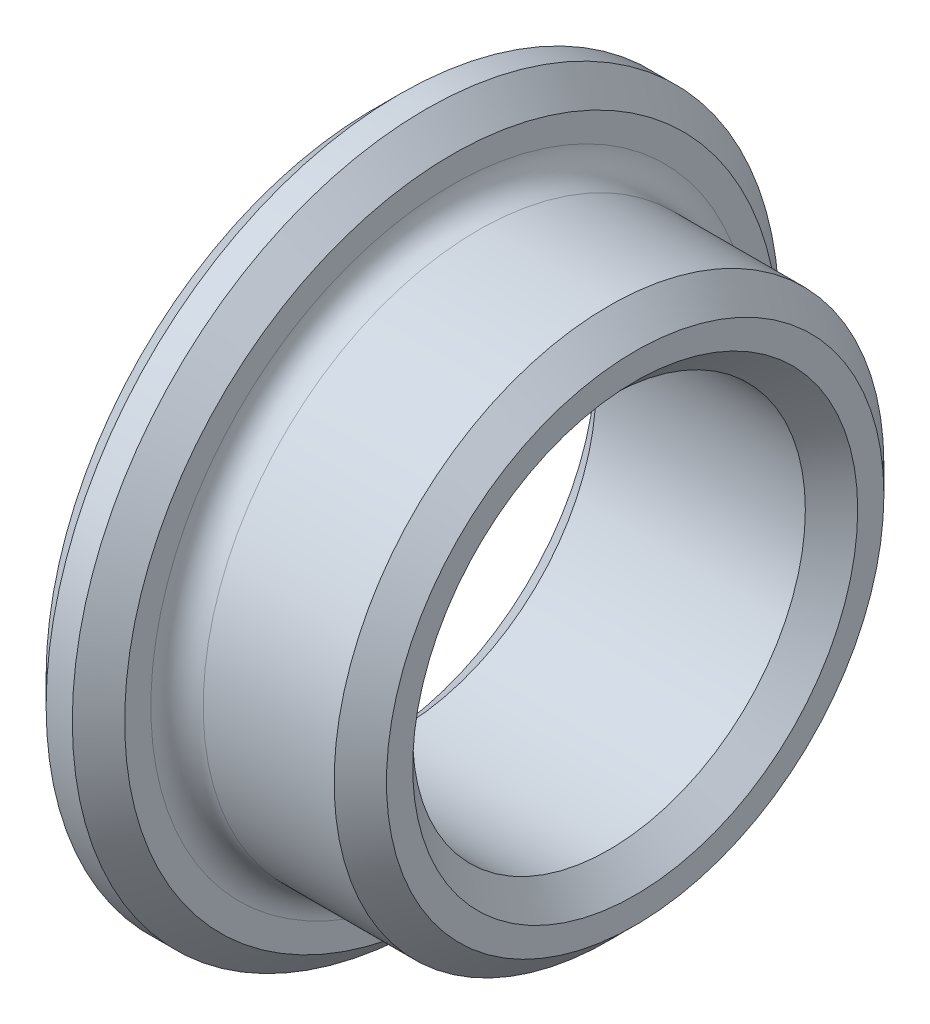
ISO-10303-21;
HEADER;
FILE_DESCRIPTION(('STEP AP214'),'2;1');
FILE_NAME('part.step','',(''),(''),'','','');
FILE_SCHEMA(('AUTOMOTIVE_DESIGN { 1 0 10303 214 1 1 1 1 }'));
ENDSEC;
DATA;
#1=APPLICATION_CONTEXT('core data for automotive mechanical design processes');
#2=APPLICATION_PROTOCOL_DEFINITION('international standard','automotive_design',2000,#1);
#3=PRODUCT_CONTEXT('',#1,'mechanical');
#4=PRODUCT('Part','Part','',(#3));
#5=PRODUCT_RELATED_PRODUCT_CATEGORY('part','',(#4));
#6=PRODUCT_DEFINITION_FORMATION('','',#4);
#7=PRODUCT_DEFINITION_CONTEXT('part definition',#1,'design');
#8=PRODUCT_DEFINITION('design','',#6,#7);
#9=PRODUCT_DEFINITION_SHAPE('','',#8);
#10=(LENGTH_UNIT() NAMED_UNIT(*) SI_UNIT(.MILLI.,.METRE.));
#11=(NAMED_UNIT(*) PLANE_ANGLE_UNIT() SI_UNIT($,.RADIAN.));
#12=(NAMED_UNIT(*) SI_UNIT($,.STERADIAN.) SOLID_ANGLE_UNIT());
#13=UNCERTAINTY_MEASURE_WITH_UNIT(LENGTH_MEASURE(1.E-05),#10,'distance_accuracy_value','');
#14=(GEOMETRIC_REPRESENTATION_CONTEXT(3) GLOBAL_UNCERTAINTY_ASSIGNED_CONTEXT((#13)) GLOBAL_UNIT_ASSIGNED_CONTEXT((#10,
#11,#12)) REPRESENTATION_CONTEXT('',''));
#15=CARTESIAN_POINT('',(0.,0.,0.));
#16=DIRECTION('',(0.,0.,1.));
#17=DIRECTION('',(1.,0.,0.));
#18=AXIS2_PLACEMENT_3D('',#15,#16,#17);
#19=CARTESIAN_POINT('',(0.,13.5,0.));
#20=DIRECTION('',(1.,0.,0.));
#21=DIRECTION('',(0.,0.,1.));
#22=AXIS2_PLACEMENT_3D('',#19,#20,#21);
#23=PLANE('',#22);
#24=CARTESIAN_POINT('',(0.,0.,0.));
#25=DIRECTION('',(-1.,0.,0.));
#26=DIRECTION('',(0.,0.,1.));
#27=AXIS2_PLACEMENT_3D('',#24,#25,#26);
#28=CIRCLE('',#27,8.5);
#29=CARTESIAN_POINT('',(0.,0.,8.5));
#30=VERTEX_POINT('',#29);
#31=EDGE_CURVE('E67',#30,#30,#28,.T.);
#32=ORIENTED_EDGE('',*,*,#31,.F.);
#33=EDGE_LOOP('',(#32));
#34=FACE_BOUND('',#33,.T.);
#35=CARTESIAN_POINT('',(0.,0.,0.));
#36=DIRECTION('',(-1.,0.,0.));
#37=DIRECTION('',(0.,0.,1.));
#38=AXIS2_PLACEMENT_3D('',#35,#36,#37);
#39=CIRCLE('',#38,12.5);
#40=CARTESIAN_POINT('',(0.,0.,12.5));
#41=VERTEX_POINT('',#40);
#42=EDGE_CURVE('E70',#41,#41,#39,.F.);
#43=ORIENTED_EDGE('',*,*,#42,.F.);
#44=EDGE_LOOP('',(#43));
#45=FACE_BOUND('',#44,.T.);
#46=ADVANCED_FACE('F35',(#34,#45),#23,.F.);
#47=CARTESIAN_POINT('',(0.,0.,0.));
#48=DIRECTION('',(-1.,0.,0.));
#49=DIRECTION('',(0.,0.,-1.));
#50=AXIS2_PLACEMENT_3D('',#47,#48,#49);
#51=CYLINDRICAL_SURFACE('',#50,7.5);
#52=CARTESIAN_POINT('',(1.,0.,0.));
#53=DIRECTION('',(-1.,0.,0.));
#54=DIRECTION('',(0.,0.,1.));
#55=AXIS2_PLACEMENT_3D('',#52,#53,#54);
#56=CIRCLE('',#55,7.5);
#57=CARTESIAN_POINT('',(1.,0.,7.5));
#58=VERTEX_POINT('',#57);
#59=EDGE_CURVE('E73',#58,#58,#56,.F.);
#60=ORIENTED_EDGE('',*,*,#59,.F.);
#61=EDGE_LOOP('',(#60));
#62=FACE_BOUND('',#61,.T.);
#63=CARTESIAN_POINT('',(9.,0.,0.));
#64=DIRECTION('',(1.,0.,0.));
#65=DIRECTION('',(0.,0.,-1.));
#66=AXIS2_PLACEMENT_3D('',#63,#64,#65);
#67=CIRCLE('',#66,7.5);
#68=CARTESIAN_POINT('',(9.,0.,-7.5));
#69=VERTEX_POINT('',#68);
#70=EDGE_CURVE('E76',#69,#69,#67,.F.);
#71=ORIENTED_EDGE('',*,*,#70,.F.);
#72=EDGE_LOOP('',(#71));
#73=FACE_BOUND('',#72,.T.);
#74=ADVANCED_FACE('F83',(#62,#73),#51,.F.);
#75=CARTESIAN_POINT('',(10.,7.5,0.));
#76=DIRECTION('',(-1.,0.,0.));
#77=DIRECTION('',(0.,0.,-1.));
#78=AXIS2_PLACEMENT_3D('',#75,#76,#77);
#79=PLANE('',#78);
#80=CARTESIAN_POINT('',(10.,0.,0.));
#81=DIRECTION('',(1.,0.,0.));
#82=DIRECTION('',(0.,0.,-1.));
#83=AXIS2_PLACEMENT_3D('',#80,#81,#82);
#84=CIRCLE('',#83,8.5);
#85=CARTESIAN_POINT('',(10.,0.,-8.5));
#86=VERTEX_POINT('',#85);
#87=EDGE_CURVE('E61',#86,#86,#84,.T.);
#88=ORIENTED_EDGE('',*,*,#87,.F.);
#89=EDGE_LOOP('',(#88));
#90=FACE_BOUND('',#89,.T.);
#91=CARTESIAN_POINT('',(10.,0.,0.));
#92=DIRECTION('',(1.,0.,0.));
#93=DIRECTION('',(0.,0.,-1.));
#94=AXIS2_PLACEMENT_3D('',#91,#92,#93);
#95=CIRCLE('',#94,9.49999999999999);
#96=CARTESIAN_POINT('',(10.,0.,-9.49999999999999));
#97=VERTEX_POINT('',#96);
#98=EDGE_CURVE('E64',#97,#97,#95,.F.);
#99=ORIENTED_EDGE('',*,*,#98,.F.);
#100=EDGE_LOOP('',(#99));
#101=FACE_BOUND('',#100,.T.);
#102=ADVANCED_FACE('F85',(#90,#101),#79,.F.);
#103=CARTESIAN_POINT('',(0.,0.,0.));
#104=DIRECTION('',(-1.,0.,0.));
#105=DIRECTION('',(0.,0.,-1.));
#106=AXIS2_PLACEMENT_3D('',#103,#104,#105);
#107=CYLINDRICAL_SURFACE('',#106,10.5);
#108=CARTESIAN_POINT('',(4.,0.,0.));
#109=DIRECTION('',(1.,0.,0.));
#110=DIRECTION('',(0.,0.,-1.));
#111=AXIS2_PLACEMENT_3D('',#108,#109,#110);
#112=CIRCLE('',#111,10.5);
#113=CARTESIAN_POINT('',(4.,0.,-10.5));
#114=VERTEX_POINT('',#113);
#115=EDGE_CURVE('E10',#114,#114,#112,.F.);
#116=ORIENTED_EDGE('',*,*,#115,.F.);
#117=EDGE_LOOP('',(#116));
#118=FACE_BOUND('',#117,.T.);
#119=CARTESIAN_POINT('',(8.99999999999999,0.,0.));
#120=DIRECTION('',(1.,0.,0.));
#121=DIRECTION('',(0.,0.,-1.));
#122=AXIS2_PLACEMENT_3D('',#119,#120,#121);
#123=CIRCLE('',#122,10.5);
#124=CARTESIAN_POINT('',(8.99999999999999,0.,-10.5));
#125=VERTEX_POINT('',#124);
#126=EDGE_CURVE('E46',#125,#125,#123,.T.);
#127=ORIENTED_EDGE('',*,*,#126,.F.);
#128=EDGE_LOOP('',(#127));
#129=FACE_BOUND('',#128,.T.);
#130=ADVANCED_FACE('F92',(#118,#129),#107,.T.);
#131=CARTESIAN_POINT('',(3.,10.5,0.));
#132=DIRECTION('',(-1.,0.,0.));
#133=DIRECTION('',(0.,0.,-1.));
#134=AXIS2_PLACEMENT_3D('',#131,#132,#133);
#135=PLANE('',#134);
#136=CARTESIAN_POINT('',(3.,0.,0.));
#137=DIRECTION('',(1.,0.,0.));
#138=DIRECTION('',(0.,0.,-1.));
#139=AXIS2_PLACEMENT_3D('',#136,#137,#138);
#140=CIRCLE('',#139,11.5);
#141=CARTESIAN_POINT('',(3.,0.,-11.5));
#142=VERTEX_POINT('',#141);
#143=EDGE_CURVE('E42',#142,#142,#140,.T.);
#144=ORIENTED_EDGE('',*,*,#143,.F.);
#145=EDGE_LOOP('',(#144));
#146=FACE_BOUND('',#145,.T.);
#147=CARTESIAN_POINT('',(3.,0.,0.));
#148=DIRECTION('',(1.,0.,0.));
#149=DIRECTION('',(0.,0.,-1.));
#150=AXIS2_PLACEMENT_3D('',#147,#148,#149);
#151=CIRCLE('',#150,12.5);
#152=CARTESIAN_POINT('',(3.,0.,-12.5));
#153=VERTEX_POINT('',#152);
#154=EDGE_CURVE('E50',#153,#153,#151,.F.);
#155=ORIENTED_EDGE('',*,*,#154,.F.);
#156=EDGE_LOOP('',(#155));
#157=FACE_BOUND('',#156,.T.);
#158=ADVANCED_FACE('F125',(#146,#157),#135,.F.);
#159=CARTESIAN_POINT('',(0.,0.,0.));
#160=DIRECTION('',(-1.,0.,0.));
#161=DIRECTION('',(0.,0.,-1.));
#162=AXIS2_PLACEMENT_3D('',#159,#160,#161);
#163=CYLINDRICAL_SURFACE('',#162,13.5);
#164=CARTESIAN_POINT('',(1.99999999999999,0.,0.));
#165=DIRECTION('',(1.,0.,0.));
#166=DIRECTION('',(0.,0.,-1.));
#167=AXIS2_PLACEMENT_3D('',#164,#165,#166);
#168=CIRCLE('',#167,13.5);
#169=CARTESIAN_POINT('',(1.99999999999999,0.,-13.5));
#170=VERTEX_POINT('',#169);
#171=EDGE_CURVE('E55',#170,#170,#168,.T.);
#172=ORIENTED_EDGE('',*,*,#171,.F.);
#173=EDGE_LOOP('',(#172));
#174=FACE_BOUND('',#173,.T.);
#175=CARTESIAN_POINT('',(0.999999999999993,0.,0.));
#176=DIRECTION('',(-1.,0.,0.));
#177=DIRECTION('',(0.,0.,1.));
#178=AXIS2_PLACEMENT_3D('',#175,#176,#177);
#179=CIRCLE('',#178,13.5);
#180=CARTESIAN_POINT('',(0.999999999999993,0.,13.5));
#181=VERTEX_POINT('',#180);
#182=EDGE_CURVE('E58',#181,#181,#179,.T.);
#183=ORIENTED_EDGE('',*,*,#182,.F.);
#184=EDGE_LOOP('',(#183));
#185=FACE_BOUND('',#184,.T.);
#186=ADVANCED_FACE('F103',(#174,#185),#163,.T.);
#187=CARTESIAN_POINT('',(1.,0.,0.));
#188=DIRECTION('',(-1.,0.,0.));
#189=DIRECTION('',(0.,0.,-1.));
#190=AXIS2_PLACEMENT_3D('',#187,#188,#189);
#191=CONICAL_SURFACE('',#190,7.5,0.785398163397449);
#192=ORIENTED_EDGE('',*,*,#31,.T.);
#193=EDGE_LOOP('',(#192));
#194=FACE_BOUND('',#193,.T.);
#195=ORIENTED_EDGE('',*,*,#59,.T.);
#196=EDGE_LOOP('',(#195));
#197=FACE_BOUND('',#196,.T.);
#198=ADVANCED_FACE('F100',(#194,#197),#191,.F.);
#199=CARTESIAN_POINT('',(10.,0.,0.));
#200=DIRECTION('',(1.,0.,0.));
#201=DIRECTION('',(0.,0.,1.));
#202=AXIS2_PLACEMENT_3D('',#199,#200,#201);
#203=CONICAL_SURFACE('',#202,8.5,0.785398163397446);
#204=ORIENTED_EDGE('',*,*,#70,.T.);
#205=EDGE_LOOP('',(#204));
#206=FACE_BOUND('',#205,.T.);
#207=ORIENTED_EDGE('',*,*,#87,.T.);
#208=EDGE_LOOP('',(#207));
#209=FACE_BOUND('',#208,.T.);
#210=ADVANCED_FACE('F80',(#206,#209),#203,.F.);
#211=CARTESIAN_POINT('',(1.99999999999999,0.,0.));
#212=DIRECTION('',(-1.,0.,0.));
#213=DIRECTION('',(0.,0.,-1.));
#214=AXIS2_PLACEMENT_3D('',#211,#212,#213);
#215=CONICAL_SURFACE('',#214,13.5,0.78539816339745);
#216=ORIENTED_EDGE('',*,*,#154,.T.);
#217=EDGE_LOOP('',(#216));
#218=FACE_BOUND('',#217,.T.);
#219=ORIENTED_EDGE('',*,*,#171,.T.);
#220=EDGE_LOOP('',(#219));
#221=FACE_BOUND('',#220,.T.);
#222=ADVANCED_FACE('F107',(#218,#221),#215,.T.);
#223=CARTESIAN_POINT('',(0.,0.,0.));
#224=DIRECTION('',(1.,0.,0.));
#225=DIRECTION('',(0.,0.,1.));
#226=AXIS2_PLACEMENT_3D('',#223,#224,#225);
#227=CONICAL_SURFACE('',#226,12.5,0.785398163397449);
#228=ORIENTED_EDGE('',*,*,#182,.T.);
#229=EDGE_LOOP('',(#228));
#230=FACE_BOUND('',#229,.T.);
#231=ORIENTED_EDGE('',*,*,#42,.T.);
#232=EDGE_LOOP('',(#231));
#233=FACE_BOUND('',#232,.T.);
#234=ADVANCED_FACE('F110',(#230,#233),#227,.T.);
#235=CARTESIAN_POINT('',(8.99999999999999,0.,0.));
#236=DIRECTION('',(-1.,0.,0.));
#237=DIRECTION('',(0.,0.,-1.));
#238=AXIS2_PLACEMENT_3D('',#235,#236,#237);
#239=CONICAL_SURFACE('',#238,10.5,0.785398163397449);
#240=ORIENTED_EDGE('',*,*,#98,.T.);
#241=EDGE_LOOP('',(#240));
#242=FACE_BOUND('',#241,.T.);
#243=ORIENTED_EDGE('',*,*,#126,.T.);
#244=EDGE_LOOP('',(#243));
#245=FACE_BOUND('',#244,.T.);
#246=ADVANCED_FACE('F113',(#242,#245),#239,.T.);
#247=CARTESIAN_POINT('',(4.,0.,0.));
#248=DIRECTION('',(-1.,0.,0.));
#249=DIRECTION('',(0.,0.,-1.));
#250=AXIS2_PLACEMENT_3D('',#247,#248,#249);
#251=TOROIDAL_SURFACE('',#250,11.5,1.);
#252=ORIENTED_EDGE('',*,*,#115,.T.);
#253=EDGE_LOOP('',(#252));
#254=FACE_BOUND('',#253,.T.);
#255=ORIENTED_EDGE('',*,*,#143,.T.);
#256=EDGE_LOOP('',(#255));
#257=FACE_BOUND('',#256,.T.);
#258=ADVANCED_FACE('F37',(#254,#257),#251,.F.);
#259=CLOSED_SHELL('',(#46,#74,#102,#130,#158,#186,#198,#210,#222,#234,#246,#258));
#260=MANIFOLD_SOLID_BREP('B2',#259);
#261=ADVANCED_BREP_SHAPE_REPRESENTATION('',(#18,#260),#14);
#262=SHAPE_DEFINITION_REPRESENTATION(#9,#261);
ENDSEC;
END-ISO-10303-21;
